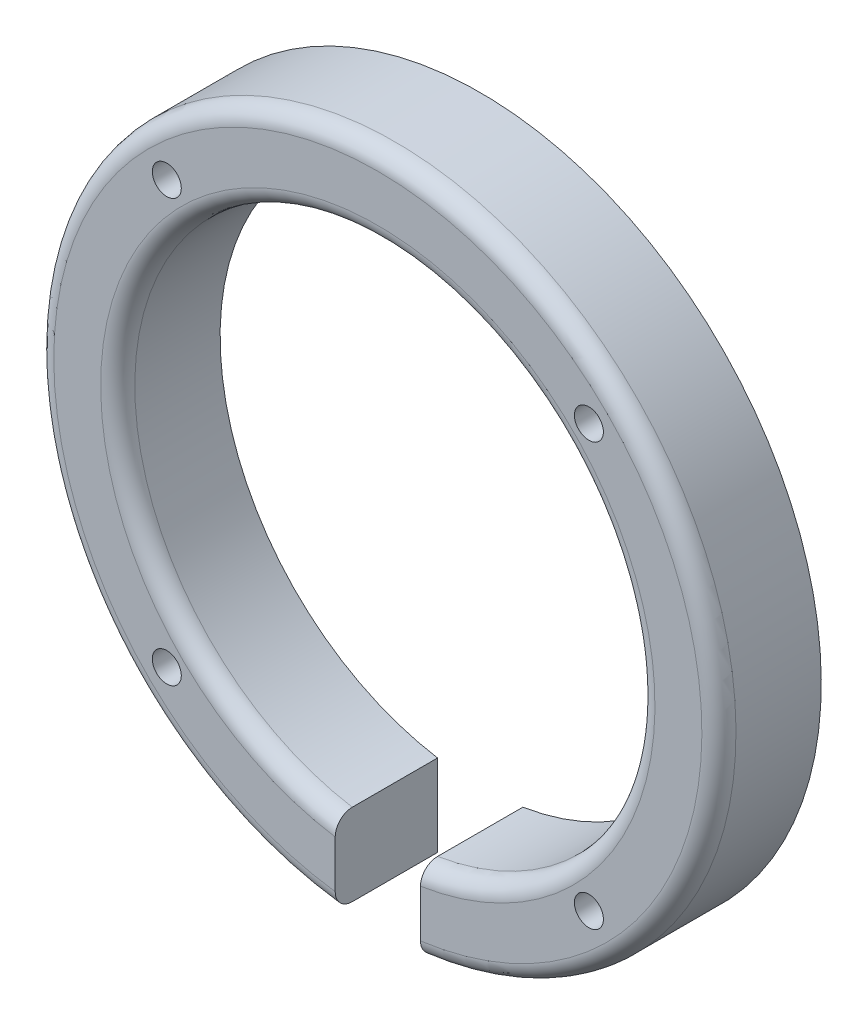
ISO-10303-21;
HEADER;
FILE_DESCRIPTION(('STEP AP214'),'2;1');
FILE_NAME('part.step','',(''),(''),'','','');
FILE_SCHEMA(('AUTOMOTIVE_DESIGN { 1 0 10303 214 1 1 1 1 }'));
ENDSEC;
DATA;
#1=APPLICATION_CONTEXT('core data for automotive mechanical design processes');
#2=APPLICATION_PROTOCOL_DEFINITION('international standard','automotive_design',2000,#1);
#3=PRODUCT_CONTEXT('',#1,'mechanical');
#4=PRODUCT('Part','Part','',(#3));
#5=PRODUCT_RELATED_PRODUCT_CATEGORY('part','',(#4));
#6=PRODUCT_DEFINITION_FORMATION('','',#4);
#7=PRODUCT_DEFINITION_CONTEXT('part definition',#1,'design');
#8=PRODUCT_DEFINITION('design','',#6,#7);
#9=PRODUCT_DEFINITION_SHAPE('','',#8);
#10=(LENGTH_UNIT() NAMED_UNIT(*) SI_UNIT(.MILLI.,.METRE.));
#11=(NAMED_UNIT(*) PLANE_ANGLE_UNIT() SI_UNIT($,.RADIAN.));
#12=(NAMED_UNIT(*) SI_UNIT($,.STERADIAN.) SOLID_ANGLE_UNIT());
#13=UNCERTAINTY_MEASURE_WITH_UNIT(LENGTH_MEASURE(1.E-05),#10,'distance_accuracy_value','');
#14=(GEOMETRIC_REPRESENTATION_CONTEXT(3) GLOBAL_UNCERTAINTY_ASSIGNED_CONTEXT((#13)) GLOBAL_UNIT_ASSIGNED_CONTEXT((#10,
#11,#12)) REPRESENTATION_CONTEXT('',''));
#15=CARTESIAN_POINT('',(0.,0.,0.));
#16=DIRECTION('',(0.,0.,1.));
#17=DIRECTION('',(1.,0.,0.));
#18=AXIS2_PLACEMENT_3D('',#15,#16,#17);
#19=CARTESIAN_POINT('',(0.,0.,12.));
#20=DIRECTION('',(0.,0.,1.));
#21=DIRECTION('',(1.,0.,0.));
#22=AXIS2_PLACEMENT_3D('',#19,#20,#21);
#23=PLANE('',#22);
#24=DIRECTION('',(0.,1.,0.));
#25=VECTOR('',#24,1.);
#26=CARTESIAN_POINT('',(5.,0.,12.));
#27=LINE('',#26,#25);
#28=CARTESIAN_POINT('',(5.,-37.6696164036747,12.));
#29=VERTEX_POINT('',#28);
#30=CARTESIAN_POINT('',(5.,-32.1130814466628,12.));
#31=VERTEX_POINT('',#30);
#32=EDGE_CURVE('E165',#29,#31,#27,.T.);
#33=ORIENTED_EDGE('',*,*,#32,.F.);
#34=CARTESIAN_POINT('',(0.,0.,12.));
#35=DIRECTION('',(0.,0.,1.));
#36=DIRECTION('',(1.,0.,0.));
#37=AXIS2_PLACEMENT_3D('',#34,#35,#36);
#38=CIRCLE('',#37,38.);
#39=CARTESIAN_POINT('',(-5.,-37.6696164036747,12.));
#40=VERTEX_POINT('',#39);
#41=EDGE_CURVE('E126',#29,#40,#38,.T.);
#42=ORIENTED_EDGE('',*,*,#41,.T.);
#43=DIRECTION('',(0.,-1.,0.));
#44=VECTOR('',#43,1.);
#45=CARTESIAN_POINT('',(-5.,0.,12.));
#46=LINE('',#45,#44);
#47=CARTESIAN_POINT('',(-5.,-32.1130814466628,12.));
#48=VERTEX_POINT('',#47);
#49=EDGE_CURVE('E59',#48,#40,#46,.T.);
#50=ORIENTED_EDGE('',*,*,#49,.F.);
#51=CARTESIAN_POINT('',(0.,0.,12.));
#52=DIRECTION('',(0.,0.,1.));
#53=DIRECTION('',(1.,0.,0.));
#54=AXIS2_PLACEMENT_3D('',#51,#52,#53);
#55=CIRCLE('',#54,32.5);
#56=EDGE_CURVE('E118',#48,#31,#55,.F.);
#57=ORIENTED_EDGE('',*,*,#56,.T.);
#58=EDGE_LOOP('',(#33,#42,#50,#57));
#59=FACE_BOUND('',#58,.T.);
#60=CARTESIAN_POINT('',(-24.7487373415291,24.7487373415292,12.));
#61=DIRECTION('',(0.,0.,1.));
#62=DIRECTION('',(1.,0.,0.));
#63=AXIS2_PLACEMENT_3D('',#60,#61,#62);
#64=CIRCLE('',#63,1.7);
#65=CARTESIAN_POINT('',(-23.0487373415291,24.7487373415292,12.));
#66=VERTEX_POINT('',#65);
#67=EDGE_CURVE('E181',#66,#66,#64,.T.);
#68=ORIENTED_EDGE('',*,*,#67,.F.);
#69=EDGE_LOOP('',(#68));
#70=FACE_BOUND('',#69,.T.);
#71=CARTESIAN_POINT('',(-24.7487373415292,-24.7487373415291,12.));
#72=DIRECTION('',(0.,0.,1.));
#73=DIRECTION('',(1.,0.,0.));
#74=AXIS2_PLACEMENT_3D('',#71,#72,#73);
#75=CIRCLE('',#74,1.69999999999999);
#76=CARTESIAN_POINT('',(-23.0487373415292,-24.7487373415291,12.));
#77=VERTEX_POINT('',#76);
#78=EDGE_CURVE('E175',#77,#77,#75,.T.);
#79=ORIENTED_EDGE('',*,*,#78,.F.);
#80=EDGE_LOOP('',(#79));
#81=FACE_BOUND('',#80,.T.);
#82=CARTESIAN_POINT('',(24.7487373415291,-24.7487373415292,12.));
#83=DIRECTION('',(0.,0.,1.));
#84=DIRECTION('',(1.,0.,0.));
#85=AXIS2_PLACEMENT_3D('',#82,#83,#84);
#86=CIRCLE('',#85,1.7);
#87=CARTESIAN_POINT('',(26.4487373415291,-24.7487373415292,12.));
#88=VERTEX_POINT('',#87);
#89=EDGE_CURVE('E168',#88,#88,#86,.T.);
#90=ORIENTED_EDGE('',*,*,#89,.F.);
#91=EDGE_LOOP('',(#90));
#92=FACE_BOUND('',#91,.T.);
#93=CARTESIAN_POINT('',(24.7487373415292,24.7487373415291,12.));
#94=DIRECTION('',(0.,0.,1.));
#95=DIRECTION('',(1.,0.,0.));
#96=AXIS2_PLACEMENT_3D('',#93,#94,#95);
#97=CIRCLE('',#96,1.70000000000001);
#98=CARTESIAN_POINT('',(26.4487373415292,24.7487373415291,12.));
#99=VERTEX_POINT('',#98);
#100=EDGE_CURVE('E171',#99,#99,#97,.T.);
#101=ORIENTED_EDGE('',*,*,#100,.F.);
#102=EDGE_LOOP('',(#101));
#103=FACE_BOUND('',#102,.T.);
#104=ADVANCED_FACE('F39',(#59,#70,#81,#92,#103),#23,.T.);
#105=CARTESIAN_POINT('',(0.,0.,0.));
#106=DIRECTION('',(0.,0.,1.));
#107=DIRECTION('',(1.,0.,0.));
#108=AXIS2_PLACEMENT_3D('',#105,#106,#107);
#109=PLANE('',#108);
#110=CARTESIAN_POINT('',(-24.7487373415291,24.7487373415292,0.));
#111=DIRECTION('',(0.,0.,1.));
#112=DIRECTION('',(1.,0.,0.));
#113=AXIS2_PLACEMENT_3D('',#110,#111,#112);
#114=CIRCLE('',#113,1.7);
#115=CARTESIAN_POINT('',(-23.0487373415291,24.7487373415292,0.));
#116=VERTEX_POINT('',#115);
#117=EDGE_CURVE('E167',#116,#116,#114,.T.);
#118=ORIENTED_EDGE('',*,*,#117,.T.);
#119=EDGE_LOOP('',(#118));
#120=FACE_BOUND('',#119,.T.);
#121=CARTESIAN_POINT('',(-24.7487373415292,-24.7487373415291,0.));
#122=DIRECTION('',(0.,0.,1.));
#123=DIRECTION('',(1.,0.,0.));
#124=AXIS2_PLACEMENT_3D('',#121,#122,#123);
#125=CIRCLE('',#124,1.69999999999999);
#126=CARTESIAN_POINT('',(-23.0487373415292,-24.7487373415291,0.));
#127=VERTEX_POINT('',#126);
#128=EDGE_CURVE('E178',#127,#127,#125,.T.);
#129=ORIENTED_EDGE('',*,*,#128,.T.);
#130=EDGE_LOOP('',(#129));
#131=FACE_BOUND('',#130,.T.);
#132=CARTESIAN_POINT('',(24.7487373415291,-24.7487373415292,0.));
#133=DIRECTION('',(0.,0.,1.));
#134=DIRECTION('',(1.,0.,0.));
#135=AXIS2_PLACEMENT_3D('',#132,#133,#134);
#136=CIRCLE('',#135,1.7);
#137=CARTESIAN_POINT('',(26.4487373415291,-24.7487373415292,0.));
#138=VERTEX_POINT('',#137);
#139=EDGE_CURVE('E172',#138,#138,#136,.T.);
#140=ORIENTED_EDGE('',*,*,#139,.T.);
#141=EDGE_LOOP('',(#140));
#142=FACE_BOUND('',#141,.T.);
#143=CARTESIAN_POINT('',(24.7487373415292,24.7487373415291,0.));
#144=DIRECTION('',(0.,0.,1.));
#145=DIRECTION('',(1.,0.,0.));
#146=AXIS2_PLACEMENT_3D('',#143,#144,#145);
#147=CIRCLE('',#146,1.70000000000001);
#148=CARTESIAN_POINT('',(26.4487373415292,24.7487373415291,0.));
#149=VERTEX_POINT('',#148);
#150=EDGE_CURVE('E120',#149,#149,#147,.T.);
#151=ORIENTED_EDGE('',*,*,#150,.T.);
#152=EDGE_LOOP('',(#151));
#153=FACE_BOUND('',#152,.T.);
#154=CARTESIAN_POINT('',(0.,0.,0.));
#155=DIRECTION('',(0.,0.,1.));
#156=DIRECTION('',(1.,0.,0.));
#157=AXIS2_PLACEMENT_3D('',#154,#155,#156);
#158=CIRCLE('',#157,40.);
#159=CARTESIAN_POINT('',(5.,-39.6862696659689,0.));
#160=VERTEX_POINT('',#159);
#161=CARTESIAN_POINT('',(-5.,-39.6862696659689,0.));
#162=VERTEX_POINT('',#161);
#163=EDGE_CURVE('E109',#160,#162,#158,.T.);
#164=ORIENTED_EDGE('',*,*,#163,.F.);
#165=DIRECTION('',(0.,1.,0.));
#166=VECTOR('',#165,1.);
#167=CARTESIAN_POINT('',(5.,-40.,0.));
#168=LINE('',#167,#166);
#169=CARTESIAN_POINT('',(5.,-30.0873727666608,0.));
#170=VERTEX_POINT('',#169);
#171=EDGE_CURVE('E112',#160,#170,#168,.T.);
#172=ORIENTED_EDGE('',*,*,#171,.T.);
#173=CARTESIAN_POINT('',(0.,0.,0.));
#174=DIRECTION('',(0.,0.,1.));
#175=DIRECTION('',(1.,0.,0.));
#176=AXIS2_PLACEMENT_3D('',#173,#174,#175);
#177=CIRCLE('',#176,30.5);
#178=CARTESIAN_POINT('',(-5.,-30.0873727666608,0.));
#179=VERTEX_POINT('',#178);
#180=EDGE_CURVE('E111',#170,#179,#177,.T.);
#181=ORIENTED_EDGE('',*,*,#180,.T.);
#182=DIRECTION('',(0.,1.,0.));
#183=VECTOR('',#182,1.);
#184=CARTESIAN_POINT('',(-5.,-40.,0.));
#185=LINE('',#184,#183);
#186=EDGE_CURVE('E97',#162,#179,#185,.T.);
#187=ORIENTED_EDGE('',*,*,#186,.F.);
#188=EDGE_LOOP('',(#164,#172,#181,#187));
#189=FACE_BOUND('',#188,.T.);
#190=ADVANCED_FACE('F107',(#120,#131,#142,#153,#189),#109,.F.);
#191=CARTESIAN_POINT('',(0.,0.,12.));
#192=DIRECTION('',(0.,0.,-1.));
#193=DIRECTION('',(-1.,0.,0.));
#194=AXIS2_PLACEMENT_3D('',#191,#192,#193);
#195=CYLINDRICAL_SURFACE('',#194,40.);
#196=CARTESIAN_POINT('',(0.,0.,10.));
#197=DIRECTION('',(0.,0.,1.));
#198=DIRECTION('',(1.,0.,0.));
#199=AXIS2_PLACEMENT_3D('',#196,#197,#198);
#200=CIRCLE('',#199,40.);
#201=CARTESIAN_POINT('',(-5.,-39.6862696659721,9.99999999999967));
#202=VERTEX_POINT('',#201);
#203=CARTESIAN_POINT('',(5.,-39.6862696659689,10.));
#204=VERTEX_POINT('',#203);
#205=EDGE_CURVE('E129',#202,#204,#200,.F.);
#206=ORIENTED_EDGE('',*,*,#205,.T.);
#207=DIRECTION('',(0.,0.,-1.));
#208=VECTOR('',#207,1.);
#209=CARTESIAN_POINT('',(5.,-39.6862696659689,12.));
#210=LINE('',#209,#208);
#211=EDGE_CURVE('E66',#204,#160,#210,.T.);
#212=ORIENTED_EDGE('',*,*,#211,.T.);
#213=ORIENTED_EDGE('',*,*,#163,.T.);
#214=DIRECTION('',(0.,0.,-1.));
#215=VECTOR('',#214,1.);
#216=CARTESIAN_POINT('',(-5.,-39.6862696659689,12.));
#217=LINE('',#216,#215);
#218=EDGE_CURVE('E94',#162,#202,#217,.F.);
#219=ORIENTED_EDGE('',*,*,#218,.T.);
#220=EDGE_LOOP('',(#206,#212,#213,#219));
#221=FACE_BOUND('',#220,.T.);
#222=ADVANCED_FACE('F114',(#221),#195,.T.);
#223=CARTESIAN_POINT('',(0.,0.,12.));
#224=DIRECTION('',(0.,0.,-1.));
#225=DIRECTION('',(-1.,0.,0.));
#226=AXIS2_PLACEMENT_3D('',#223,#224,#225);
#227=CYLINDRICAL_SURFACE('',#226,30.5);
#228=DIRECTION('',(0.,0.,-1.));
#229=VECTOR('',#228,1.);
#230=CARTESIAN_POINT('',(5.,-30.0873727666608,12.));
#231=LINE('',#230,#229);
#232=CARTESIAN_POINT('',(5.,-30.0873727666608,10.));
#233=VERTEX_POINT('',#232);
#234=EDGE_CURVE('E164',#233,#170,#231,.T.);
#235=ORIENTED_EDGE('',*,*,#234,.F.);
#236=CARTESIAN_POINT('',(0.,0.,10.));
#237=DIRECTION('',(0.,0.,1.));
#238=DIRECTION('',(1.,0.,0.));
#239=AXIS2_PLACEMENT_3D('',#236,#237,#238);
#240=CIRCLE('',#239,30.5);
#241=CARTESIAN_POINT('',(-5.,-30.0873727666552,10.0000000000005));
#242=VERTEX_POINT('',#241);
#243=EDGE_CURVE('E115',#233,#242,#240,.T.);
#244=ORIENTED_EDGE('',*,*,#243,.T.);
#245=DIRECTION('',(0.,0.,-1.));
#246=VECTOR('',#245,1.);
#247=CARTESIAN_POINT('',(-5.,-30.0873727666608,12.));
#248=LINE('',#247,#246);
#249=EDGE_CURVE('E147',#179,#242,#248,.F.);
#250=ORIENTED_EDGE('',*,*,#249,.F.);
#251=ORIENTED_EDGE('',*,*,#180,.F.);
#252=EDGE_LOOP('',(#235,#244,#250,#251));
#253=FACE_BOUND('',#252,.T.);
#254=ADVANCED_FACE('F203',(#253),#227,.F.);
#255=CARTESIAN_POINT('',(24.7487373415292,24.7487373415291,0.));
#256=DIRECTION('',(0.,0.,1.));
#257=DIRECTION('',(1.,0.,0.));
#258=AXIS2_PLACEMENT_3D('',#255,#256,#257);
#259=CYLINDRICAL_SURFACE('',#258,1.70000000000001);
#260=ORIENTED_EDGE('',*,*,#150,.F.);
#261=EDGE_LOOP('',(#260));
#262=FACE_BOUND('',#261,.T.);
#263=ORIENTED_EDGE('',*,*,#100,.T.);
#264=EDGE_LOOP('',(#263));
#265=FACE_BOUND('',#264,.T.);
#266=ADVANCED_FACE('F190',(#262,#265),#259,.F.);
#267=CARTESIAN_POINT('',(24.7487373415291,-24.7487373415292,0.));
#268=DIRECTION('',(0.,0.,1.));
#269=DIRECTION('',(1.,0.,0.));
#270=AXIS2_PLACEMENT_3D('',#267,#268,#269);
#271=CYLINDRICAL_SURFACE('',#270,1.7);
#272=ORIENTED_EDGE('',*,*,#139,.F.);
#273=EDGE_LOOP('',(#272));
#274=FACE_BOUND('',#273,.T.);
#275=ORIENTED_EDGE('',*,*,#89,.T.);
#276=EDGE_LOOP('',(#275));
#277=FACE_BOUND('',#276,.T.);
#278=ADVANCED_FACE('F209',(#274,#277),#271,.F.);
#279=CARTESIAN_POINT('',(-24.7487373415292,-24.7487373415291,0.));
#280=DIRECTION('',(0.,0.,1.));
#281=DIRECTION('',(1.,0.,0.));
#282=AXIS2_PLACEMENT_3D('',#279,#280,#281);
#283=CYLINDRICAL_SURFACE('',#282,1.69999999999999);
#284=ORIENTED_EDGE('',*,*,#128,.F.);
#285=EDGE_LOOP('',(#284));
#286=FACE_BOUND('',#285,.T.);
#287=ORIENTED_EDGE('',*,*,#78,.T.);
#288=EDGE_LOOP('',(#287));
#289=FACE_BOUND('',#288,.T.);
#290=ADVANCED_FACE('F212',(#286,#289),#283,.F.);
#291=CARTESIAN_POINT('',(-24.7487373415291,24.7487373415292,0.));
#292=DIRECTION('',(0.,0.,1.));
#293=DIRECTION('',(1.,0.,0.));
#294=AXIS2_PLACEMENT_3D('',#291,#292,#293);
#295=CYLINDRICAL_SURFACE('',#294,1.7);
#296=ORIENTED_EDGE('',*,*,#117,.F.);
#297=EDGE_LOOP('',(#296));
#298=FACE_BOUND('',#297,.T.);
#299=ORIENTED_EDGE('',*,*,#67,.T.);
#300=EDGE_LOOP('',(#299));
#301=FACE_BOUND('',#300,.T.);
#302=ADVANCED_FACE('F153',(#298,#301),#295,.F.);
#303=CARTESIAN_POINT('',(0.,0.,10.));
#304=DIRECTION('',(0.,0.,1.));
#305=DIRECTION('',(1.,0.,0.));
#306=AXIS2_PLACEMENT_3D('',#303,#304,#305);
#307=TOROIDAL_SURFACE('',#306,32.5,2.);
#308=CARTESIAN_POINT('',(5.,-31.5833731532517,11.9303261440004));
#309=CARTESIAN_POINT('',(5.,-31.4730871254735,11.9007912264945));
#310=CARTESIAN_POINT('',(5.,-31.3652012342651,11.8619835005619));
#311=CARTESIAN_POINT('',(5.,-31.1573566625115,11.7668246771766));
#312=CARTESIAN_POINT('',(5.,-31.0574072337512,11.7104534715131));
#313=CARTESIAN_POINT('',(5.,-30.8684104662194,11.5816877733996));
#314=CARTESIAN_POINT('',(5.,-30.7793627063805,11.5092939001147));
#315=CARTESIAN_POINT('',(5.,-30.6148357337957,11.3504853624041));
#316=CARTESIAN_POINT('',(5.,-30.5393528263868,11.2640745280197));
#317=CARTESIAN_POINT('',(5.,-30.4047748508597,11.080404519357));
#318=CARTESIAN_POINT('',(5.,-30.3455502821222,10.9832402702825));
#319=CARTESIAN_POINT('',(5.,-30.2444955961056,10.7802467704364));
#320=CARTESIAN_POINT('',(5.,-30.2026648881009,10.6744178140794));
#321=CARTESIAN_POINT('',(5.,-30.138125347521,10.4585452036052));
#322=CARTESIAN_POINT('',(5.,-30.1151808458616,10.3485719803041));
#323=CARTESIAN_POINT('',(5.,-30.088244103026,10.1263305181502));
#324=CARTESIAN_POINT('',(5.,-30.0842507639343,10.0140624126274));
#325=CARTESIAN_POINT('',(5.,-30.0952951008862,9.79135730450662));
#326=CARTESIAN_POINT('',(5.,-30.1101831627956,9.6809128443745));
#327=CARTESIAN_POINT('',(5.,-30.1582741369438,9.46408954901227));
#328=CARTESIAN_POINT('',(5.,-30.1914768977192,9.35771068016732));
#329=CARTESIAN_POINT('',(5.,-30.2752291640058,9.15189543619121));
#330=CARTESIAN_POINT('',(5.,-30.3257962250271,9.05246621014777));
#331=CARTESIAN_POINT('',(5.,-30.4427587315323,8.86340345517362));
#332=CARTESIAN_POINT('',(5.,-30.5091548378841,8.77377033546154));
#333=CARTESIAN_POINT('',(5.,-30.656523274425,8.6059354443168));
#334=CARTESIAN_POINT('',(5.,-30.7376249557355,8.52784728028182));
#335=CARTESIAN_POINT('',(5.,-30.9116427107543,8.38618673938443));
#336=CARTESIAN_POINT('',(5.,-31.0045595612365,8.32261531767642));
#337=CARTESIAN_POINT('',(5.,-31.2008408888961,8.2109406818133));
#338=CARTESIAN_POINT('',(5.,-31.304323476327,8.1630450381527));
#339=CARTESIAN_POINT('',(5.,-31.5178067371707,8.08510637370594));
#340=CARTESIAN_POINT('',(5.,-31.6278078072715,8.05506444065236));
#341=CARTESIAN_POINT('',(5.,-31.8524054966855,8.01341146189287));
#342=CARTESIAN_POINT('',(5.,-31.9670374441188,8.0019907127203));
#343=CARTESIAN_POINT('',(5.,-32.1965988223291,7.99848643530976));
#344=CARTESIAN_POINT('',(5.,-32.3115282616204,8.00640346677555));
#345=CARTESIAN_POINT('',(5.,-32.5388072222358,8.04143976377932));
#346=CARTESIAN_POINT('',(5.,-32.6511471966115,8.06862105503895));
#347=CARTESIAN_POINT('',(5.,-32.8696364154192,8.14154238869002));
#348=CARTESIAN_POINT('',(5.,-32.9757857471066,8.18728216943249));
#349=CARTESIAN_POINT('',(5.,-33.1783436629524,8.29584172175324));
#350=CARTESIAN_POINT('',(5.,-33.2747941147513,8.35858334108465));
#351=CARTESIAN_POINT('',(5.,-33.455658088671,8.49951797655954));
#352=CARTESIAN_POINT('',(5.,-33.5400722004868,8.57771023528362));
#353=CARTESIAN_POINT('',(5.,-33.6935767278873,8.74651898963516));
#354=CARTESIAN_POINT('',(5.,-33.7628085965181,8.83700684275146));
#355=CARTESIAN_POINT('',(5.,-33.8849039165799,9.02842445319101));
#356=CARTESIAN_POINT('',(5.,-33.9377683579229,9.12935357852701));
#357=CARTESIAN_POINT('',(5.,-34.0250467132699,9.33763023512173));
#358=CARTESIAN_POINT('',(5.,-34.0596512488671,9.44489790361934));
#359=CARTESIAN_POINT('',(5.,-34.1102105825472,9.66374107597227));
#360=CARTESIAN_POINT('',(5.,-34.1261662903085,9.77531636942998));
#361=CARTESIAN_POINT('',(5.,-34.1388954784505,9.99873117771856));
#362=CARTESIAN_POINT('',(5.,-34.135808876385,10.1105627440236));
#363=CARTESIAN_POINT('',(5.,-34.1108749646742,10.3321125423428));
#364=CARTESIAN_POINT('',(5.,-34.089027957221,10.4418308083689));
#365=CARTESIAN_POINT('',(5.,-34.0272731274683,10.6558947648642));
#366=CARTESIAN_POINT('',(5.,-33.9873900201384,10.7602475904187));
#367=CARTESIAN_POINT('',(5.,-33.890755209165,10.9608233853494));
#368=CARTESIAN_POINT('',(5.,-33.8340031744443,11.0570461951145));
#369=CARTESIAN_POINT('',(5.,-33.7049657368123,11.239171344708));
#370=CARTESIAN_POINT('',(5.,-33.6326033894907,11.3250191513246));
#371=CARTESIAN_POINT('',(5.,-33.474619961628,11.4834870553973));
#372=CARTESIAN_POINT('',(5.,-33.3889988013756,11.556107073323));
#373=CARTESIAN_POINT('',(5.,-33.2060652166287,11.6868101360261));
#374=CARTESIAN_POINT('',(5.,-33.1086494124318,11.7447484623366));
#375=CARTESIAN_POINT('',(5.,-32.9055246740829,11.8436608862252));
#376=CARTESIAN_POINT('',(5.,-32.7998132471874,11.8846298613031));
#377=CARTESIAN_POINT('',(5.,-32.5818760116364,11.9488826533181));
#378=CARTESIAN_POINT('',(5.,-32.4695908393077,11.9719647657103));
#379=CARTESIAN_POINT('',(5.,-32.2428343433349,11.9990684041199));
#380=CARTESIAN_POINT('',(5.,-32.1283656202733,12.0031113366908));
#381=CARTESIAN_POINT('',(5.,-31.9416460886206,11.9941174876396));
#382=CARTESIAN_POINT('',(5.,-31.8690770760815,11.9867212791301));
#383=CARTESIAN_POINT('',(5.,-31.725137151649,11.9642513669327));
#384=CARTESIAN_POINT('',(5.,-31.6537662467831,11.949177618229));
#385=CARTESIAN_POINT('',(5.,-31.5833731532517,11.9303261440004));
#386=B_SPLINE_CURVE_WITH_KNOTS('',3,(#308,#309,#310,#311,#312,#313,#314,#315,#316,#317,#318,
#319,#320,#321,#322,#323,#324,#325,#326,#327,#328,#329,#330,#331,#332,#333,#334,#335,#336,#337,
#338,#339,#340,#341,#342,#343,#344,#345,#346,#347,#348,#349,#350,#351,#352,#353,#354,#355,#356,
#357,#358,#359,#360,#361,#362,#363,#364,#365,#366,#367,#368,#369,#370,#371,#372,#373,#374,#375,
#376,#377,#378,#379,#380,#381,#382,#383,#384,#385),.UNSPECIFIED.,.T.,.F.,(4,2,2,2,2,2,2,2,2,2,2,
2,2,2,2,2,2,2,2,2,2,2,2,2,2,2,2,2,2,2,2,2,2,2,2,2,2,2,4),(0.,0.342254039377626,
0.684901370038392,1.02753546206358,1.37007608882185,1.70980345492783,2.04951928236212,
2.38492884205702,2.72031896991895,3.05306803244067,3.385814343154,3.71889805959139,
4.05199568482095,4.38817950607502,4.72438544076086,5.06487832609865,5.40539195374903,
5.74936408434167,6.09334617082229,6.43844084802495,6.78353066003999,7.12706034640791,
7.47057319648052,7.81073499736746,8.15087622104187,8.4873925945451,8.82389255229983,
9.15792296214983,9.49194799154679,9.82551668503654,10.1590919257291,10.4943505668279,
10.8296112235608,11.1680581890904,11.5066072465247,11.8489205979532,12.1908489799968,
12.4093007624128,12.627753825695),.UNSPECIFIED.);
#387=EDGE_CURVE('E158',#31,#233,#386,.T.);
#388=ORIENTED_EDGE('',*,*,#387,.F.);
#389=ORIENTED_EDGE('',*,*,#56,.F.);
#390=CARTESIAN_POINT('',(-5.,-31.5833731532517,11.9303261440004));
#391=CARTESIAN_POINT('',(-5.,-31.6944373116169,11.960059361974));
#392=CARTESIAN_POINT('',(-5.,-31.8080966702421,11.9804315139131));
#393=CARTESIAN_POINT('',(-5.,-32.0373215426172,12.0018397825947));
#394=CARTESIAN_POINT('',(-5.,-32.1528892843628,12.0028514235407));
#395=CARTESIAN_POINT('',(-5.,-32.3825194708385,11.9854589851591));
#396=CARTESIAN_POINT('',(-5.,-32.4965825197932,11.9670629553291));
#397=CARTESIAN_POINT('',(-5.,-32.7199556134817,11.9113423549321));
#398=CARTESIAN_POINT('',(-5.,-32.8292669542126,11.8740229812002));
#399=CARTESIAN_POINT('',(-5.,-33.0397799339487,11.7815561419992));
#400=CARTESIAN_POINT('',(-5.,-33.1409993266533,11.7264491210384));
#401=CARTESIAN_POINT('',(-5.,-33.3326431021087,11.5998761082389));
#402=CARTESIAN_POINT('',(-5.,-33.4230674541486,11.5284100698619));
#403=CARTESIAN_POINT('',(-5.,-33.5896714277678,11.3718160931433));
#404=CARTESIAN_POINT('',(-5.,-33.6659709332929,11.2868157237988));
#405=CARTESIAN_POINT('',(-5.,-33.8030275342888,11.1050914665319));
#406=CARTESIAN_POINT('',(-5.,-33.8637856161484,11.0083683232094));
#407=CARTESIAN_POINT('',(-5.,-33.9673433336339,10.8070733153312));
#408=CARTESIAN_POINT('',(-5.,-34.0103307269329,10.7025980324341));
#409=CARTESIAN_POINT('',(-5.,-34.077986300308,10.4878758727868));
#410=CARTESIAN_POINT('',(-5.,-34.102655477218,10.3776293104456));
#411=CARTESIAN_POINT('',(-5.,-34.1327942677448,10.1554894325566));
#412=CARTESIAN_POINT('',(-5.,-34.1384235884609,10.0436177606721));
#413=CARTESIAN_POINT('',(-5.,-34.1307607620563,9.82052605550992));
#414=CARTESIAN_POINT('',(-5.,-34.1174690769429,9.70930600638768));
#415=CARTESIAN_POINT('',(-5.,-34.0724315838049,9.49100269409135));
#416=CARTESIAN_POINT('',(-5.,-34.0407386545616,9.38390851109438));
#417=CARTESIAN_POINT('',(-5.,-33.959886418872,9.17653295474194));
#418=CARTESIAN_POINT('',(-5.,-33.9107269560891,9.07625164237556));
#419=CARTESIAN_POINT('',(-5.,-33.7961810695209,8.88493543409237));
#420=CARTESIAN_POINT('',(-5.,-33.7307361701228,8.79393556205526));
#421=CARTESIAN_POINT('',(-5.,-33.5856211152483,8.62409348836194));
#422=CARTESIAN_POINT('',(-5.,-33.505950389402,8.54525177441105));
#423=CARTESIAN_POINT('',(-5.,-33.3339069930469,8.40120735630812));
#424=CARTESIAN_POINT('',(-5.,-33.2414285191562,8.33613104160503));
#425=CARTESIAN_POINT('',(-5.,-33.0469529929579,8.22223403056468));
#426=CARTESIAN_POINT('',(-5.,-32.9449554007016,8.17341425705817));
#427=CARTESIAN_POINT('',(-5.,-32.7331592147007,8.0928667772091));
#428=CARTESIAN_POINT('',(-5.,-32.6232883674996,8.06132903431388));
#429=CARTESIAN_POINT('',(-5.,-32.3998303196157,8.01697307149773));
#430=CARTESIAN_POINT('',(-5.,-32.2862429213149,8.00415584865205));
#431=CARTESIAN_POINT('',(-5.,-32.0575445967637,7.99753297862868));
#432=CARTESIAN_POINT('',(-5.,-31.9424289315245,8.00389005865565));
#433=CARTESIAN_POINT('',(-5.,-31.7148844925235,8.03578975061452));
#434=CARTESIAN_POINT('',(-5.,-31.6024557892982,8.06133286563719));
#435=CARTESIAN_POINT('',(-5.,-31.3832175762254,8.13100284143923));
#436=CARTESIAN_POINT('',(-5.,-31.2764218071979,8.17517297708484));
#437=CARTESIAN_POINT('',(-5.,-31.0718181296682,8.28091287884066));
#438=CARTESIAN_POINT('',(-5.,-30.9740100587918,8.34248233052826));
#439=CARTESIAN_POINT('',(-5.,-30.7907797109352,8.48094588723263));
#440=CARTESIAN_POINT('',(-5.,-30.7052909872396,8.55775202556775));
#441=CARTESIAN_POINT('',(-5.,-30.5486090425271,8.72477817772023));
#442=CARTESIAN_POINT('',(-5.,-30.4774149250728,8.81499734976709));
#443=CARTESIAN_POINT('',(-5.,-30.3522452820767,9.0051681625429));
#444=CARTESIAN_POINT('',(-5.,-30.2980782477934,9.10499373786501));
#445=CARTESIAN_POINT('',(-5.,-30.2075144415956,9.3124047071063));
#446=CARTESIAN_POINT('',(-5.,-30.1711163554617,9.41998952646382));
#447=CARTESIAN_POINT('',(-5.,-30.1175674094968,9.63843446212086));
#448=CARTESIAN_POINT('',(-5.,-30.1001841981743,9.74923765478924));
#449=CARTESIAN_POINT('',(-5.,-30.0844068940089,9.97218609771658));
#450=CARTESIAN_POINT('',(-5.,-30.0860119186198,10.0843312853595));
#451=CARTESIAN_POINT('',(-5.,-30.1080841413926,10.3059849027456));
#452=CARTESIAN_POINT('',(-5.,-30.1284247244775,10.4155059745571));
#453=CARTESIAN_POINT('',(-5.,-30.1871620963237,10.6295861368363));
#454=CARTESIAN_POINT('',(-5.,-30.2255581749643,10.7341454222724));
#455=CARTESIAN_POINT('',(-5.,-30.3193512541211,10.9356232886737));
#456=CARTESIAN_POINT('',(-5.,-30.3747868533346,11.0325238878298));
#457=CARTESIAN_POINT('',(-5.,-30.5010012062875,11.2157914257092));
#458=CARTESIAN_POINT('',(-5.,-30.5717844641908,11.302155260497));
#459=CARTESIAN_POINT('',(-5.,-30.7274480434837,11.4628558687496));
#460=CARTESIAN_POINT('',(-5.,-30.8124700867284,11.5370551806167));
#461=CARTESIAN_POINT('',(-5.,-30.9935689077281,11.6702678621279));
#462=CARTESIAN_POINT('',(-5.,-31.0896331952445,11.7292981500029));
#463=CARTESIAN_POINT('',(-5.,-31.2526092020146,11.8117513884205));
#464=CARTESIAN_POINT('',(-5.,-31.3170126925009,11.8402397118041));
#465=CARTESIAN_POINT('',(-5.,-31.4484111985305,11.8904293263747));
#466=CARTESIAN_POINT('',(-5.,-31.5154062296283,11.912130576818));
#467=CARTESIAN_POINT('',(-5.,-31.5833731532517,11.9303261440004));
#468=B_SPLINE_CURVE_WITH_KNOTS('',3,(#390,#391,#392,#393,#394,#395,#396,#397,#398,#399,#400,
#401,#402,#403,#404,#405,#406,#407,#408,#409,#410,#411,#412,#413,#414,#415,#416,#417,#418,#419,
#420,#421,#422,#423,#424,#425,#426,#427,#428,#429,#430,#431,#432,#433,#434,#435,#436,#437,#438,
#439,#440,#441,#442,#443,#444,#445,#446,#447,#448,#449,#450,#451,#452,#453,#454,#455,#456,#457,
#458,#459,#460,#461,#462,#463,#464,#465,#466,#467),.UNSPECIFIED.,.T.,.F.,(4,2,2,2,2,2,2,2,2,2,2,
2,2,2,2,2,2,2,2,2,2,2,2,2,2,2,2,2,2,2,2,2,2,2,2,2,2,2,4),(0.,0.344669021376381,
0.689773748834213,1.03473539740714,1.37960236194163,1.72369064749564,2.06777991193009,
2.40879947271637,2.7497973841751,3.08709421566663,3.42437269091664,3.75881494908091,
4.0932490410759,4.42672680914376,4.7602075621248,5.09490346312058,5.42961278642329,
5.76727335730136,6.10495309280087,6.44627371737672,6.78761252039741,7.13185630250106,
7.47610911158262,7.821166144116,8.16621694153073,8.50933076178772,8.85242305810985,
9.19150565295153,9.53056316490837,9.8654296248806,10.200280520797,10.5328849639123,
10.8654763268257,11.198826713476,11.532275063076,11.8692644829102,12.2058764061354,
12.4167991085588,12.6277230771556),.UNSPECIFIED.);
#469=EDGE_CURVE('E141',#242,#48,#468,.T.);
#470=ORIENTED_EDGE('',*,*,#469,.F.);
#471=ORIENTED_EDGE('',*,*,#243,.F.);
#472=EDGE_LOOP('',(#388,#389,#470,#471));
#473=FACE_BOUND('',#472,.T.);
#474=ADVANCED_FACE('F149',(#473),#307,.T.);
#475=CARTESIAN_POINT('',(0.,0.,10.));
#476=DIRECTION('',(0.,0.,1.));
#477=DIRECTION('',(1.,0.,0.));
#478=AXIS2_PLACEMENT_3D('',#475,#476,#477);
#479=TOROIDAL_SURFACE('',#478,38.,2.);
#480=CARTESIAN_POINT('',(5.,-39.3591627471761,11.0921390293593));
#481=CARTESIAN_POINT('',(5.,-39.2971577934789,11.1864945766962));
#482=CARTESIAN_POINT('',(5.,-39.2270883919773,11.275653840356));
#483=CARTESIAN_POINT('',(5.,-39.0728855125321,11.4409863671419));
#484=CARTESIAN_POINT('',(5.,-38.988733972582,11.5171426957338));
#485=CARTESIAN_POINT('',(5.,-38.8089233882758,11.654218923493));
#486=CARTESIAN_POINT('',(5.,-38.7132738327307,11.7151512602301));
#487=CARTESIAN_POINT('',(5.,-38.5131785663703,11.8201821990121));
#488=CARTESIAN_POINT('',(5.,-38.4087350279105,11.8642849436232));
#489=CARTESIAN_POINT('',(5.,-38.1933353565011,11.9347154929086));
#490=CARTESIAN_POINT('',(5.,-38.082344486599,11.9609370692332));
#491=CARTESIAN_POINT('',(5.,-37.8575379471978,11.9944918151871));
#492=CARTESIAN_POINT('',(5.,-37.7437220596565,12.0018235222414));
#493=CARTESIAN_POINT('',(5.,-37.5158178766026,11.9973963404948));
#494=CARTESIAN_POINT('',(5.,-37.4017316619324,11.9855296084712));
#495=CARTESIAN_POINT('',(5.,-37.1771639271053,11.9428283745798));
#496=CARTESIAN_POINT('',(5.,-37.0666824511908,11.9119936400014));
#497=CARTESIAN_POINT('',(5.,-36.8523898598823,11.832164609981));
#498=CARTESIAN_POINT('',(5.,-36.7485837808842,11.783156787788));
#499=CARTESIAN_POINT('',(5.,-36.5507277879313,11.668326187394));
#500=CARTESIAN_POINT('',(5.,-36.4566776665524,11.6025037667962));
#501=CARTESIAN_POINT('',(5.,-36.2815257074894,11.4562357731172));
#502=CARTESIAN_POINT('',(5.,-36.2003618950801,11.3758644328823));
#503=CARTESIAN_POINT('',(5.,-36.0528248588289,11.2025299287475));
#504=CARTESIAN_POINT('',(5.,-35.9864509551535,11.1095673439332));
#505=CARTESIAN_POINT('',(5.,-35.8710050458347,10.9145611018162));
#506=CARTESIAN_POINT('',(5.,-35.8217861229725,10.8126044244798));
#507=CARTESIAN_POINT('',(5.,-35.7413325389063,10.6018265286824));
#508=CARTESIAN_POINT('',(5.,-35.7100969276641,10.4930056731852));
#509=CARTESIAN_POINT('',(5.,-35.6667493577303,10.2725841548862));
#510=CARTESIAN_POINT('',(5.,-35.6544768567001,10.1610150445447));
#511=CARTESIAN_POINT('',(5.,-35.6489199100364,9.93740655699671));
#512=CARTESIAN_POINT('',(5.,-35.6556348854573,9.8253671942327));
#513=CARTESIAN_POINT('',(5.,-35.6877833933788,9.60446531736975));
#514=CARTESIAN_POINT('',(5.,-35.7131424486681,9.49559194987089));
#515=CARTESIAN_POINT('',(5.,-35.7817335234253,9.28363150854328));
#516=CARTESIAN_POINT('',(5.,-35.8249656373,9.18054446528155));
#517=CARTESIAN_POINT('',(5.,-35.9281565742106,8.98277847056377));
#518=CARTESIAN_POINT('',(5.,-35.9881581272994,8.88812182392214));
#519=CARTESIAN_POINT('',(5.,-36.1230862805496,8.71012488850606));
#520=CARTESIAN_POINT('',(5.,-36.1980134262934,8.62678501358646));
#521=CARTESIAN_POINT('',(5.,-36.3612759434914,8.47308656379703));
#522=CARTESIAN_POINT('',(5.,-36.4497107459082,8.40283362002886));
#523=CARTESIAN_POINT('',(5.,-36.6370308054245,8.27801241156233));
#524=CARTESIAN_POINT('',(5.,-36.7359165760372,8.22344491806659));
#525=CARTESIAN_POINT('',(5.,-36.9422979055111,8.13103136971401));
#526=CARTESIAN_POINT('',(5.,-37.0498635540032,8.09334181477956));
#527=CARTESIAN_POINT('',(5.,-37.2697748163769,8.03642978126689));
#528=CARTESIAN_POINT('',(5.,-37.3821206213842,8.01720804181597));
#529=CARTESIAN_POINT('',(5.,-37.6091517691793,7.99769098263616));
#530=CARTESIAN_POINT('',(5.,-37.7238473219723,7.99751422172282));
#531=CARTESIAN_POINT('',(5.,-37.9516451458376,8.01640016895268));
#532=CARTESIAN_POINT('',(5.,-38.0647473979534,8.03546310580746));
#533=CARTESIAN_POINT('',(5.,-38.2862328419096,8.09234649668099));
#534=CARTESIAN_POINT('',(5.,-38.3946121569974,8.13018205578441));
#535=CARTESIAN_POINT('',(5.,-38.603438138861,8.22359314087361));
#536=CARTESIAN_POINT('',(5.,-38.7038849338412,8.27916838007923));
#537=CARTESIAN_POINT('',(5.,-38.8934866159097,8.40623271640358));
#538=CARTESIAN_POINT('',(5.,-38.9826910299466,8.47764789365882));
#539=CARTESIAN_POINT('',(5.,-39.1477279941604,8.63454643341365));
#540=CARTESIAN_POINT('',(5.,-39.2235610505929,8.72002926305822));
#541=CARTESIAN_POINT('',(5.,-39.3590800142065,8.90193839459732));
#542=CARTESIAN_POINT('',(5.,-39.4188850118616,8.99827597403495));
#543=CARTESIAN_POINT('',(5.,-39.521327965883,9.19967870982619));
#544=CARTESIAN_POINT('',(5.,-39.5639673559553,9.30474313641146));
#545=CARTESIAN_POINT('',(5.,-39.6305498885276,9.51976257314327));
#546=CARTESIAN_POINT('',(5.,-39.6546323105144,9.62967447179122));
#547=CARTESIAN_POINT('',(5.,-39.6839175016567,9.85201546910206));
#548=CARTESIAN_POINT('',(5.,-39.68911606831,9.96444512247734));
#549=CARTESIAN_POINT('',(5.,-39.6804895496926,10.1881238497522));
#550=CARTESIAN_POINT('',(5.,-39.6667378755278,10.2993758064737));
#551=CARTESIAN_POINT('',(5.,-39.6207526130518,10.5178931187229));
#552=CARTESIAN_POINT('',(5.,-39.5885417187585,10.625163197516));
#553=CARTESIAN_POINT('',(5.,-39.5225448975507,10.7924834582214));
#554=CARTESIAN_POINT('',(5.,-39.4941974918344,10.8547355347362));
#555=CARTESIAN_POINT('',(5.,-39.4312725702795,10.9760060536694));
#556=CARTESIAN_POINT('',(5.,-39.396695074958,11.035024506736));
#557=CARTESIAN_POINT('',(5.,-39.3591627471761,11.0921390293593));
#558=B_SPLINE_CURVE_WITH_KNOTS('',3,(#480,#481,#482,#483,#484,#485,#486,#487,#488,#489,#490,
#491,#492,#493,#494,#495,#496,#497,#498,#499,#500,#501,#502,#503,#504,#505,#506,#507,#508,#509,
#510,#511,#512,#513,#514,#515,#516,#517,#518,#519,#520,#521,#522,#523,#524,#525,#526,#527,#528,
#529,#530,#531,#532,#533,#534,#535,#536,#537,#538,#539,#540,#541,#542,#543,#544,#545,#546,#547,
#548,#549,#550,#551,#552,#553,#554,#555,#556,#557),.UNSPECIFIED.,.T.,.F.,(4,2,2,2,2,2,2,2,2,2,2,
2,2,2,2,2,2,2,2,2,2,2,2,2,2,2,2,2,2,2,2,2,2,2,2,2,2,2,4),(0.,0.338463625448548,0.67736474542387,
1.01598808073767,1.35452801082971,1.69506201395527,2.03562238261403,2.37810242902268,
2.72058667726108,3.0633263597334,3.40605875362259,3.74708934003912,4.08810424739581,
4.42612243990277,4.76412277365031,5.09924559483009,5.43435819791762,5.76813935596487,
6.10192227708923,6.43656358566219,6.77121712878909,7.10846471576722,7.44572888127866,
7.78605864928441,8.12640203755555,8.46886401011598,8.81133005373531,9.15407210504889,
9.49680861586565,9.83797813523664,10.1791347347497,10.51768142431,10.8561998319034,
11.192152047986,11.5281790238784,11.8629079219771,12.1972261799287,12.4021028681497,
12.6069788816799),.UNSPECIFIED.);
#559=EDGE_CURVE('E11',#204,#29,#558,.T.);
#560=ORIENTED_EDGE('',*,*,#559,.F.);
#561=ORIENTED_EDGE('',*,*,#205,.F.);
#562=CARTESIAN_POINT('',(-5.,-39.3591627471761,11.0921390293593));
#563=CARTESIAN_POINT('',(-5.,-39.4205306029174,10.9987347142443));
#564=CARTESIAN_POINT('',(-5.,-39.4740860690307,10.900104301821));
#565=CARTESIAN_POINT('',(-5.,-39.5639346281657,10.695177695633));
#566=CARTESIAN_POINT('',(-5.,-39.6002083237865,10.5888730414729));
#567=CARTESIAN_POINT('',(-5.,-39.654354841449,10.3716972709547));
#568=CARTESIAN_POINT('',(-5.,-39.672232982783,10.2608274843084));
#569=CARTESIAN_POINT('',(-5.,-39.6890636093423,10.0376887765187));
#570=CARTESIAN_POINT('',(-5.,-39.6880206009259,9.9254201948847));
#571=CARTESIAN_POINT('',(-5.,-39.6670786251984,9.70292542415141));
#572=CARTESIAN_POINT('',(-5.,-39.6472243635096,9.59269502429117));
#573=CARTESIAN_POINT('',(-5.,-39.5893111562353,9.37712305698122));
#574=CARTESIAN_POINT('',(-5.,-39.5512515862699,9.27178165734345));
#575=CARTESIAN_POINT('',(-5.,-39.4579922863404,9.06883510243714));
#576=CARTESIAN_POINT('',(-5.,-39.4027726772406,8.97123908531448));
#577=CARTESIAN_POINT('',(-5.,-39.2768176937233,8.78663624533708));
#578=CARTESIAN_POINT('',(-5.,-39.2060819809958,8.69962965343638));
#579=CARTESIAN_POINT('',(-5.,-39.0506987623029,8.53814643881667));
#580=CARTESIAN_POINT('',(-5.,-38.9659764109238,8.46374184604133));
#581=CARTESIAN_POINT('',(-5.,-38.7853260363094,8.33008040705091));
#582=CARTESIAN_POINT('',(-5.,-38.6893975836015,8.27082414167142));
#583=CARTESIAN_POINT('',(-5.,-38.4882548311494,8.16864808906668));
#584=CARTESIAN_POINT('',(-5.,-38.3829736806693,8.12585990224187));
#585=CARTESIAN_POINT('',(-5.,-38.1667532559992,8.05842544479681));
#586=CARTESIAN_POINT('',(-5.,-38.0558137392755,8.03377995252477));
#587=CARTESIAN_POINT('',(-5.,-37.8305854547794,8.00317119627831));
#588=CARTESIAN_POINT('',(-5.,-37.716278546465,7.9973413185223));
#589=CARTESIAN_POINT('',(-5.,-37.4882988318039,8.00488650326126));
#590=CARTESIAN_POINT('',(-5.,-37.3746260420663,8.01826206644829));
#591=CARTESIAN_POINT('',(-5.,-37.1507581059988,8.06392721926951));
#592=CARTESIAN_POINT('',(-5.,-37.0405754264467,8.09627797639328));
#593=CARTESIAN_POINT('',(-5.,-36.8272231170564,8.17906104630904));
#594=CARTESIAN_POINT('',(-5.,-36.724053463716,8.22949329850272));
#595=CARTESIAN_POINT('',(-5.,-36.5279442144421,8.34691425054343));
#596=CARTESIAN_POINT('',(-5.,-36.4349806320119,8.41386287504413));
#597=CARTESIAN_POINT('',(-5.,-36.261718992623,8.56252505111431));
#598=CARTESIAN_POINT('',(-5.,-36.1814204768865,8.64423806763022));
#599=CARTESIAN_POINT('',(-5.,-36.0364226551766,8.81947192563768));
#600=CARTESIAN_POINT('',(-5.,-35.9716117909876,8.91290044361188));
#601=CARTESIAN_POINT('',(-5.,-35.8587667471398,9.10939329088761));
#602=CARTESIAN_POINT('',(-5.,-35.8107316706254,9.21245710470002));
#603=CARTESIAN_POINT('',(-5.,-35.7332597884674,9.42427363928916));
#604=CARTESIAN_POINT('',(-5.,-35.7036555927831,9.53296514818141));
#605=CARTESIAN_POINT('',(-5.,-35.6632489681854,9.75378759070064));
#606=CARTESIAN_POINT('',(-5.,-35.6524457190658,9.86591837406935));
#607=CARTESIAN_POINT('',(-5.,-35.6499771914308,10.0896587119816));
#608=CARTESIAN_POINT('',(-5.,-35.6581880484587,10.2012669207273));
#609=CARTESIAN_POINT('',(-5.,-35.6932425935674,10.4215155881509));
#610=CARTESIAN_POINT('',(-5.,-35.7200860704004,10.5301560804609));
#611=CARTESIAN_POINT('',(-5.,-35.791583219429,10.741347968712));
#612=CARTESIAN_POINT('',(-5.,-35.8362284368999,10.8439022287116));
#613=CARTESIAN_POINT('',(-5.,-35.9420077156459,11.0401188693587));
#614=CARTESIAN_POINT('',(-5.,-36.0031421526158,11.1337810473409));
#615=CARTESIAN_POINT('',(-5.,-36.1405161497743,11.3101476236665));
#616=CARTESIAN_POINT('',(-5.,-36.2168403553377,11.3927860750011));
#617=CARTESIAN_POINT('',(-5.,-36.3821685086299,11.5442176903075));
#618=CARTESIAN_POINT('',(-5.,-36.471173064877,11.6130101894425));
#619=CARTESIAN_POINT('',(-5.,-36.6601946321398,11.7354566312306));
#620=CARTESIAN_POINT('',(-5.,-36.7603037959023,11.7889683194117));
#621=CARTESIAN_POINT('',(-5.,-36.9680336438007,11.8785795373427));
#622=CARTESIAN_POINT('',(-5.,-37.0756546923344,11.9146782217235));
#623=CARTESIAN_POINT('',(-5.,-37.2962805585579,11.9687149331254));
#624=CARTESIAN_POINT('',(-5.,-37.4093216147614,11.9865050773213));
#625=CARTESIAN_POINT('',(-5.,-37.6367840673725,12.0029271872103));
#626=CARTESIAN_POINT('',(-5.,-37.7512054473542,12.0015593806587));
#627=CARTESIAN_POINT('',(-5.,-37.9785886401997,11.9796577121484));
#628=CARTESIAN_POINT('',(-5.,-38.0915442751731,11.9590596227147));
#629=CARTESIAN_POINT('',(-5.,-38.3124112972971,11.8991424480418));
#630=CARTESIAN_POINT('',(-5.,-38.4203214529583,11.8598188182398));
#631=CARTESIAN_POINT('',(-5.,-38.6277653055126,11.7636150414367));
#632=CARTESIAN_POINT('',(-5.,-38.7273136469443,11.7067664386966));
#633=CARTESIAN_POINT('',(-5.,-38.9152750911215,11.5770918680913));
#634=CARTESIAN_POINT('',(-5.,-39.0037017767345,11.5042856933457));
#635=CARTESIAN_POINT('',(-5.,-39.1367183917308,11.3742820046629));
#636=CARTESIAN_POINT('',(-5.,-39.1854413502834,11.3212426472091));
#637=CARTESIAN_POINT('',(-5.,-39.2769097392453,11.2102371880566));
#638=CARTESIAN_POINT('',(-5.,-39.3196551892462,11.1522711025063));
#639=CARTESIAN_POINT('',(-5.,-39.3591627471761,11.0921390293593));
#640=B_SPLINE_CURVE_WITH_KNOTS('',3,(#562,#563,#564,#565,#566,#567,#568,#569,#570,#571,#572,
#573,#574,#575,#576,#577,#578,#579,#580,#581,#582,#583,#584,#585,#586,#587,#588,#589,#590,#591,
#592,#593,#594,#595,#596,#597,#598,#599,#600,#601,#602,#603,#604,#605,#606,#607,#608,#609,#610,
#611,#612,#613,#614,#615,#616,#617,#618,#619,#620,#621,#622,#623,#624,#625,#626,#627,#628,#629,
#630,#631,#632,#633,#634,#635,#636,#637,#638,#639),.UNSPECIFIED.,.T.,.F.,(4,2,2,2,2,2,2,2,2,2,2,
2,2,2,2,2,2,2,2,2,2,2,2,2,2,2,2,2,2,2,2,2,2,2,2,2,2,2,4),(0.,0.335020211088247,
0.670415574714142,1.00571392752066,1.34093242499679,1.67535625661753,2.00979155865546,
2.34461574241622,2.67944722734257,3.0161322777672,3.35283023584375,3.69216556942913,
4.03151546014982,4.37326581996228,4.71502508947898,5.05789213925179,5.40075803995096,
5.7428000545831,6.08482967628333,6.42431590574582,6.76378398305001,7.10012221512016,
7.43644577380075,7.7705845733121,8.10471958457751,8.43869609105842,8.77268020759231,
9.10858037734456,9.44449667206681,9.78344514059374,10.1224100627847,10.4640919004141,
10.8057696760354,11.1485927239165,11.4914990150829,11.8337916570919,12.1756621120653,
12.3913430026417,12.6070231863045),.UNSPECIFIED.);
#641=EDGE_CURVE('E52',#40,#202,#640,.T.);
#642=ORIENTED_EDGE('',*,*,#641,.F.);
#643=ORIENTED_EDGE('',*,*,#41,.F.);
#644=EDGE_LOOP('',(#560,#561,#642,#643));
#645=FACE_BOUND('',#644,.T.);
#646=ADVANCED_FACE('F41',(#645),#479,.T.);
#647=CARTESIAN_POINT('',(-5.,-40.,0.));
#648=DIRECTION('',(-1.,0.,0.));
#649=DIRECTION('',(0.,0.,1.));
#650=AXIS2_PLACEMENT_3D('',#647,#648,#649);
#651=PLANE('',#650);
#652=ORIENTED_EDGE('',*,*,#249,.T.);
#653=ORIENTED_EDGE('',*,*,#469,.T.);
#654=ORIENTED_EDGE('',*,*,#49,.T.);
#655=ORIENTED_EDGE('',*,*,#641,.T.);
#656=ORIENTED_EDGE('',*,*,#218,.F.);
#657=ORIENTED_EDGE('',*,*,#186,.T.);
#658=EDGE_LOOP('',(#652,#653,#654,#655,#656,#657));
#659=FACE_BOUND('',#658,.T.);
#660=ADVANCED_FACE('F96',(#659),#651,.F.);
#661=CARTESIAN_POINT('',(5.,-40.,0.));
#662=DIRECTION('',(1.,0.,0.));
#663=DIRECTION('',(0.,0.,-1.));
#664=AXIS2_PLACEMENT_3D('',#661,#662,#663);
#665=PLANE('',#664);
#666=ORIENTED_EDGE('',*,*,#234,.T.);
#667=ORIENTED_EDGE('',*,*,#171,.F.);
#668=ORIENTED_EDGE('',*,*,#211,.F.);
#669=ORIENTED_EDGE('',*,*,#559,.T.);
#670=ORIENTED_EDGE('',*,*,#32,.T.);
#671=ORIENTED_EDGE('',*,*,#387,.T.);
#672=EDGE_LOOP('',(#666,#667,#668,#669,#670,#671));
#673=FACE_BOUND('',#672,.T.);
#674=ADVANCED_FACE('F136',(#673),#665,.F.);
#675=CLOSED_SHELL('',(#104,#190,#222,#254,#266,#278,#290,#302,#474,#646,#660,#674));
#676=MANIFOLD_SOLID_BREP('B2',#675);
#677=ADVANCED_BREP_SHAPE_REPRESENTATION('',(#18,#676),#14);
#678=SHAPE_DEFINITION_REPRESENTATION(#9,#677);
ENDSEC;
END-ISO-10303-21;
